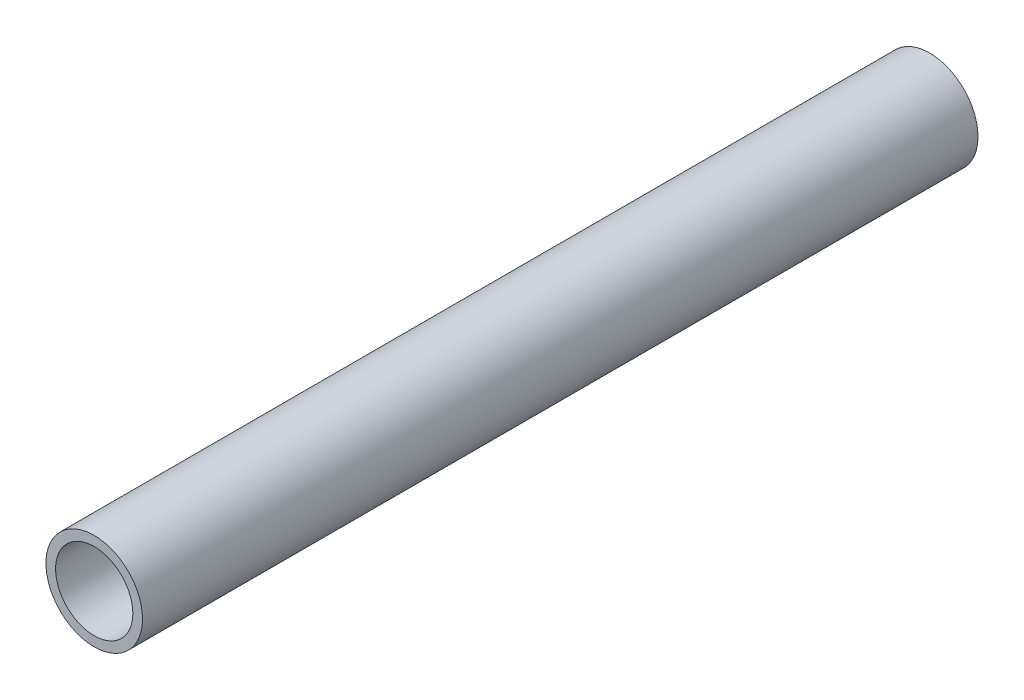
ISO-10303-21;
HEADER;
FILE_DESCRIPTION(('STEP AP214'),'2;1');
FILE_NAME('part.step','',(''),(''),'','','');
FILE_SCHEMA(('AUTOMOTIVE_DESIGN { 1 0 10303 214 1 1 1 1 }'));
ENDSEC;
DATA;
#1=APPLICATION_CONTEXT('core data for automotive mechanical design processes');
#2=APPLICATION_PROTOCOL_DEFINITION('international standard','automotive_design',2000,#1);
#3=PRODUCT_CONTEXT('',#1,'mechanical');
#4=PRODUCT('Part','Part','',(#3));
#5=PRODUCT_RELATED_PRODUCT_CATEGORY('part','',(#4));
#6=PRODUCT_DEFINITION_FORMATION('','',#4);
#7=PRODUCT_DEFINITION_CONTEXT('part definition',#1,'design');
#8=PRODUCT_DEFINITION('design','',#6,#7);
#9=PRODUCT_DEFINITION_SHAPE('','',#8);
#10=(LENGTH_UNIT() NAMED_UNIT(*) SI_UNIT(.MILLI.,.METRE.));
#11=(NAMED_UNIT(*) PLANE_ANGLE_UNIT() SI_UNIT($,.RADIAN.));
#12=(NAMED_UNIT(*) SI_UNIT($,.STERADIAN.) SOLID_ANGLE_UNIT());
#13=UNCERTAINTY_MEASURE_WITH_UNIT(LENGTH_MEASURE(1.E-05),#10,'distance_accuracy_value','');
#14=(GEOMETRIC_REPRESENTATION_CONTEXT(3) GLOBAL_UNCERTAINTY_ASSIGNED_CONTEXT((#13)) GLOBAL_UNIT_ASSIGNED_CONTEXT((#10,
#11,#12)) REPRESENTATION_CONTEXT('',''));
#15=CARTESIAN_POINT('',(0.,0.,0.));
#16=DIRECTION('',(0.,0.,1.));
#17=DIRECTION('',(1.,0.,0.));
#18=AXIS2_PLACEMENT_3D('',#15,#16,#17);
#19=CARTESIAN_POINT('',(0.,0.,173.));
#20=DIRECTION('',(0.,0.,1.));
#21=DIRECTION('',(1.,0.,0.));
#22=AXIS2_PLACEMENT_3D('',#19,#20,#21);
#23=PLANE('',#22);
#24=CARTESIAN_POINT('',(0.,0.,173.));
#25=DIRECTION('',(0.,0.,1.));
#26=DIRECTION('',(1.,0.,0.));
#27=AXIS2_PLACEMENT_3D('',#24,#25,#26);
#28=CIRCLE('',#27,10.);
#29=CARTESIAN_POINT('',(10.,0.,173.));
#30=VERTEX_POINT('',#29);
#31=EDGE_CURVE('E10',#30,#30,#28,.T.);
#32=ORIENTED_EDGE('',*,*,#31,.T.);
#33=EDGE_LOOP('',(#32));
#34=FACE_BOUND('',#33,.T.);
#35=CARTESIAN_POINT('',(0.,0.,173.));
#36=DIRECTION('',(0.,0.,1.));
#37=DIRECTION('',(1.,0.,0.));
#38=AXIS2_PLACEMENT_3D('',#35,#36,#37);
#39=CIRCLE('',#38,8.);
#40=CARTESIAN_POINT('',(8.,0.,173.));
#41=VERTEX_POINT('',#40);
#42=EDGE_CURVE('E54',#41,#41,#39,.T.);
#43=ORIENTED_EDGE('',*,*,#42,.F.);
#44=EDGE_LOOP('',(#43));
#45=FACE_BOUND('',#44,.T.);
#46=ADVANCED_FACE('F41',(#34,#45),#23,.T.);
#47=CARTESIAN_POINT('',(0.,0.,0.));
#48=DIRECTION('',(0.,0.,1.));
#49=DIRECTION('',(1.,0.,0.));
#50=AXIS2_PLACEMENT_3D('',#47,#48,#49);
#51=PLANE('',#50);
#52=CARTESIAN_POINT('',(0.,0.,0.));
#53=DIRECTION('',(0.,0.,1.));
#54=DIRECTION('',(1.,0.,0.));
#55=AXIS2_PLACEMENT_3D('',#52,#53,#54);
#56=CIRCLE('',#55,10.);
#57=CARTESIAN_POINT('',(10.,0.,0.));
#58=VERTEX_POINT('',#57);
#59=EDGE_CURVE('E45',#58,#58,#56,.T.);
#60=ORIENTED_EDGE('',*,*,#59,.F.);
#61=EDGE_LOOP('',(#60));
#62=FACE_BOUND('',#61,.T.);
#63=CARTESIAN_POINT('',(0.,0.,0.));
#64=DIRECTION('',(0.,0.,1.));
#65=DIRECTION('',(1.,0.,0.));
#66=AXIS2_PLACEMENT_3D('',#63,#64,#65);
#67=CIRCLE('',#66,8.);
#68=CARTESIAN_POINT('',(8.,0.,0.));
#69=VERTEX_POINT('',#68);
#70=EDGE_CURVE('E56',#69,#69,#67,.T.);
#71=ORIENTED_EDGE('',*,*,#70,.T.);
#72=EDGE_LOOP('',(#71));
#73=FACE_BOUND('',#72,.T.);
#74=ADVANCED_FACE('F68',(#62,#73),#51,.F.);
#75=CARTESIAN_POINT('',(0.,0.,173.));
#76=DIRECTION('',(0.,0.,-1.));
#77=DIRECTION('',(-1.,0.,0.));
#78=AXIS2_PLACEMENT_3D('',#75,#76,#77);
#79=CYLINDRICAL_SURFACE('',#78,10.);
#80=ORIENTED_EDGE('',*,*,#31,.F.);
#81=EDGE_LOOP('',(#80));
#82=FACE_BOUND('',#81,.T.);
#83=ORIENTED_EDGE('',*,*,#59,.T.);
#84=EDGE_LOOP('',(#83));
#85=FACE_BOUND('',#84,.T.);
#86=ADVANCED_FACE('F43',(#82,#85),#79,.T.);
#87=CARTESIAN_POINT('',(0.,0.,173.));
#88=DIRECTION('',(0.,0.,-1.));
#89=DIRECTION('',(-1.,0.,0.));
#90=AXIS2_PLACEMENT_3D('',#87,#88,#89);
#91=CYLINDRICAL_SURFACE('',#90,8.);
#92=ORIENTED_EDGE('',*,*,#42,.T.);
#93=EDGE_LOOP('',(#92));
#94=FACE_BOUND('',#93,.T.);
#95=ORIENTED_EDGE('',*,*,#70,.F.);
#96=EDGE_LOOP('',(#95));
#97=FACE_BOUND('',#96,.T.);
#98=ADVANCED_FACE('F64',(#94,#97),#91,.F.);
#99=CLOSED_SHELL('',(#46,#74,#86,#98));
#100=MANIFOLD_SOLID_BREP('B2',#99);
#101=ADVANCED_BREP_SHAPE_REPRESENTATION('',(#18,#100),#14);
#102=SHAPE_DEFINITION_REPRESENTATION(#9,#101);
ENDSEC;
END-ISO-10303-21;
